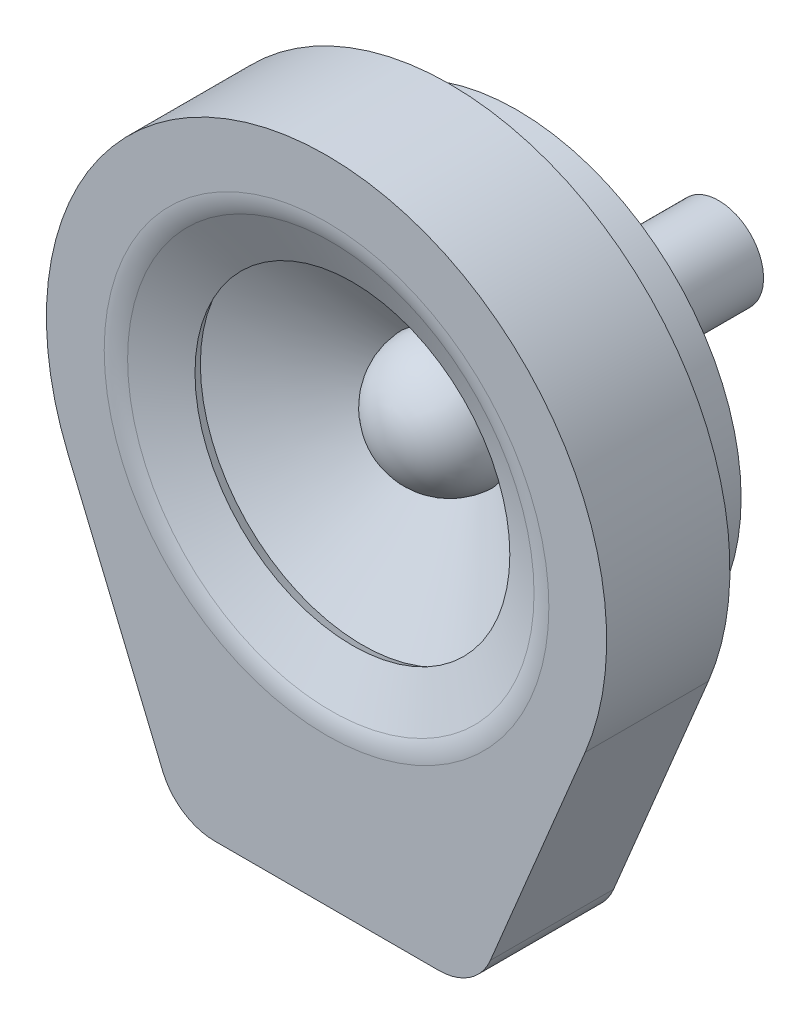
ISO-10303-21;
HEADER;
FILE_DESCRIPTION(('STEP AP214'),'2;1');
FILE_NAME('part.step','',(''),(''),'','','');
FILE_SCHEMA(('AUTOMOTIVE_DESIGN { 1 0 10303 214 1 1 1 1 }'));
ENDSEC;
DATA;
#1=APPLICATION_CONTEXT('core data for automotive mechanical design processes');
#2=APPLICATION_PROTOCOL_DEFINITION('international standard','automotive_design',2000,#1);
#3=PRODUCT_CONTEXT('',#1,'mechanical');
#4=PRODUCT('Part','Part','',(#3));
#5=PRODUCT_RELATED_PRODUCT_CATEGORY('part','',(#4));
#6=PRODUCT_DEFINITION_FORMATION('','',#4);
#7=PRODUCT_DEFINITION_CONTEXT('part definition',#1,'design');
#8=PRODUCT_DEFINITION('design','',#6,#7);
#9=PRODUCT_DEFINITION_SHAPE('','',#8);
#10=(LENGTH_UNIT() NAMED_UNIT(*) SI_UNIT(.MILLI.,.METRE.));
#11=(NAMED_UNIT(*) PLANE_ANGLE_UNIT() SI_UNIT($,.RADIAN.));
#12=(NAMED_UNIT(*) SI_UNIT($,.STERADIAN.) SOLID_ANGLE_UNIT());
#13=UNCERTAINTY_MEASURE_WITH_UNIT(LENGTH_MEASURE(1.E-05),#10,'distance_accuracy_value','');
#14=(GEOMETRIC_REPRESENTATION_CONTEXT(3) GLOBAL_UNCERTAINTY_ASSIGNED_CONTEXT((#13)) GLOBAL_UNIT_ASSIGNED_CONTEXT((#10,
#11,#12)) REPRESENTATION_CONTEXT('',''));
#15=CARTESIAN_POINT('',(0.,0.,0.));
#16=DIRECTION('',(0.,0.,1.));
#17=DIRECTION('',(1.,0.,0.));
#18=AXIS2_PLACEMENT_3D('',#15,#16,#17);
#19=CARTESIAN_POINT('',(0.,0.,0.));
#20=DIRECTION('',(0.,0.,1.));
#21=DIRECTION('',(1.,0.,0.));
#22=AXIS2_PLACEMENT_3D('',#19,#20,#21);
#23=PLANE('',#22);
#24=CARTESIAN_POINT('',(0.,0.,0.));
#25=DIRECTION('',(0.,0.,1.));
#26=DIRECTION('',(1.,0.,0.));
#27=AXIS2_PLACEMENT_3D('',#24,#25,#26);
#28=CIRCLE('',#27,12.5);
#29=CARTESIAN_POINT('',(11.5392129441462,-4.80588853695639,0.));
#30=VERTEX_POINT('',#29);
#31=CARTESIAN_POINT('',(-11.5392129441462,-4.80588853695639,0.));
#32=VERTEX_POINT('',#31);
#33=EDGE_CURVE('E145',#30,#32,#28,.T.);
#34=ORIENTED_EDGE('',*,*,#33,.F.);
#35=DIRECTION('',(0.384471082956511,0.923137035531696,0.));
#36=VECTOR('',#35,1.);
#37=CARTESIAN_POINT('',(7.30970543354696,-14.9611777073913,0.));
#38=LINE('',#37,#36);
#39=CARTESIAN_POINT('',(7.30970543354696,-14.9611777073913,0.));
#40=VERTEX_POINT('',#39);
#41=EDGE_CURVE('E69',#40,#30,#38,.T.);
#42=ORIENTED_EDGE('',*,*,#41,.F.);
#43=CARTESIAN_POINT('',(5.00186284471772,-14.,0.));
#44=DIRECTION('',(0.,0.,1.));
#45=DIRECTION('',(1.,0.,0.));
#46=AXIS2_PLACEMENT_3D('',#43,#44,#45);
#47=CIRCLE('',#46,2.5);
#48=CARTESIAN_POINT('',(5.00186284471772,-16.5,0.));
#49=VERTEX_POINT('',#48);
#50=EDGE_CURVE('E230',#49,#40,#47,.T.);
#51=ORIENTED_EDGE('',*,*,#50,.F.);
#52=DIRECTION('',(1.,0.,0.));
#53=VECTOR('',#52,1.);
#54=CARTESIAN_POINT('',(-5.00186284471772,-16.5,0.));
#55=LINE('',#54,#53);
#56=CARTESIAN_POINT('',(-5.00186284471771,-16.5,0.));
#57=VERTEX_POINT('',#56);
#58=EDGE_CURVE('E228',#57,#49,#55,.T.);
#59=ORIENTED_EDGE('',*,*,#58,.F.);
#60=CARTESIAN_POINT('',(-5.00186284471772,-14.,0.));
#61=DIRECTION('',(0.,0.,1.));
#62=DIRECTION('',(1.,0.,0.));
#63=AXIS2_PLACEMENT_3D('',#60,#61,#62);
#64=CIRCLE('',#63,2.5);
#65=CARTESIAN_POINT('',(-7.30970543354696,-14.9611777073913,0.));
#66=VERTEX_POINT('',#65);
#67=EDGE_CURVE('E226',#66,#57,#64,.T.);
#68=ORIENTED_EDGE('',*,*,#67,.F.);
#69=DIRECTION('',(0.384471082956511,-0.923137035531696,0.));
#70=VECTOR('',#69,1.);
#71=CARTESIAN_POINT('',(-7.30970543354696,-14.9611777073913,0.));
#72=LINE('',#71,#70);
#73=EDGE_CURVE('E224',#32,#66,#72,.T.);
#74=ORIENTED_EDGE('',*,*,#73,.F.);
#75=EDGE_LOOP('',(#34,#42,#51,#59,#68,#74));
#76=FACE_BOUND('',#75,.T.);
#77=CARTESIAN_POINT('',(0.,0.,0.));
#78=DIRECTION('',(0.,0.,1.));
#79=DIRECTION('',(1.,0.,0.));
#80=AXIS2_PLACEMENT_3D('',#77,#78,#79);
#81=CIRCLE('',#80,12.);
#82=CARTESIAN_POINT('',(11.0776444263804,-4.61365299547813,0.));
#83=VERTEX_POINT('',#82);
#84=CARTESIAN_POINT('',(-11.0776444263804,-4.61365299547814,0.));
#85=VERTEX_POINT('',#84);
#86=EDGE_CURVE('E61',#83,#85,#81,.T.);
#87=ORIENTED_EDGE('',*,*,#86,.T.);
#88=DIRECTION('',(0.384471082956511,-0.923137035531696,0.));
#89=VECTOR('',#88,1.);
#90=CARTESIAN_POINT('',(-6.84813691578111,-14.768942165913,0.));
#91=LINE('',#90,#89);
#92=CARTESIAN_POINT('',(-6.84813691578111,-14.768942165913,0.));
#93=VERTEX_POINT('',#92);
#94=EDGE_CURVE('E198',#85,#93,#91,.T.);
#95=ORIENTED_EDGE('',*,*,#94,.T.);
#96=CARTESIAN_POINT('',(-5.00186284471772,-14.,0.));
#97=DIRECTION('',(0.,0.,1.));
#98=DIRECTION('',(1.,0.,0.));
#99=AXIS2_PLACEMENT_3D('',#96,#97,#98);
#100=CIRCLE('',#99,2.);
#101=CARTESIAN_POINT('',(-5.00186284471772,-16.,0.));
#102=VERTEX_POINT('',#101);
#103=EDGE_CURVE('E201',#93,#102,#100,.T.);
#104=ORIENTED_EDGE('',*,*,#103,.T.);
#105=DIRECTION('',(1.,0.,0.));
#106=VECTOR('',#105,1.);
#107=CARTESIAN_POINT('',(-5.00186284471772,-16.,0.));
#108=LINE('',#107,#106);
#109=CARTESIAN_POINT('',(5.00186284471772,-16.,0.));
#110=VERTEX_POINT('',#109);
#111=EDGE_CURVE('E204',#102,#110,#108,.T.);
#112=ORIENTED_EDGE('',*,*,#111,.T.);
#113=CARTESIAN_POINT('',(5.00186284471772,-14.,0.));
#114=DIRECTION('',(0.,0.,1.));
#115=DIRECTION('',(1.,0.,0.));
#116=AXIS2_PLACEMENT_3D('',#113,#114,#115);
#117=CIRCLE('',#116,2.);
#118=CARTESIAN_POINT('',(6.84813691578111,-14.768942165913,0.));
#119=VERTEX_POINT('',#118);
#120=EDGE_CURVE('E207',#110,#119,#117,.T.);
#121=ORIENTED_EDGE('',*,*,#120,.T.);
#122=DIRECTION('',(0.384471082956511,0.923137035531696,0.));
#123=VECTOR('',#122,1.);
#124=CARTESIAN_POINT('',(6.84813691578111,-14.768942165913,0.));
#125=LINE('',#124,#123);
#126=EDGE_CURVE('E181',#119,#83,#125,.T.);
#127=ORIENTED_EDGE('',*,*,#126,.T.);
#128=EDGE_LOOP('',(#87,#95,#104,#112,#121,#127));
#129=FACE_BOUND('',#128,.T.);
#130=ADVANCED_FACE('F46',(#76,#129),#23,.F.);
#131=CARTESIAN_POINT('',(0.,0.,5.));
#132=DIRECTION('',(0.,0.,-1.));
#133=DIRECTION('',(-1.,0.,0.));
#134=AXIS2_PLACEMENT_3D('',#131,#132,#133);
#135=CYLINDRICAL_SURFACE('',#134,12.5);
#136=ORIENTED_EDGE('',*,*,#33,.T.);
#137=DIRECTION('',(0.,0.,-1.));
#138=VECTOR('',#137,1.);
#139=CARTESIAN_POINT('',(-11.5392129441462,-4.80588853695639,5.));
#140=LINE('',#139,#138);
#141=CARTESIAN_POINT('',(-11.5392129441462,-4.80588853695639,5.5));
#142=VERTEX_POINT('',#141);
#143=EDGE_CURVE('E139',#142,#32,#140,.T.);
#144=ORIENTED_EDGE('',*,*,#143,.F.);
#145=CARTESIAN_POINT('',(0.,0.,5.5));
#146=DIRECTION('',(0.,0.,1.));
#147=DIRECTION('',(1.,0.,0.));
#148=AXIS2_PLACEMENT_3D('',#145,#146,#147);
#149=CIRCLE('',#148,12.5);
#150=CARTESIAN_POINT('',(11.5392129441462,-4.80588853695639,5.5));
#151=VERTEX_POINT('',#150);
#152=EDGE_CURVE('E143',#151,#142,#149,.T.);
#153=ORIENTED_EDGE('',*,*,#152,.F.);
#154=DIRECTION('',(0.,0.,-1.));
#155=VECTOR('',#154,1.);
#156=CARTESIAN_POINT('',(11.5392129441462,-4.80588853695639,5.));
#157=LINE('',#156,#155);
#158=EDGE_CURVE('E233',#151,#30,#157,.T.);
#159=ORIENTED_EDGE('',*,*,#158,.T.);
#160=EDGE_LOOP('',(#136,#144,#153,#159));
#161=FACE_BOUND('',#160,.T.);
#162=ADVANCED_FACE('F141',(#161),#135,.T.);
#163=CARTESIAN_POINT('',(-7.30970543354696,-14.9611777073913,5.));
#164=DIRECTION('',(0.923137035531696,0.384471082956511,0.));
#165=DIRECTION('',(-0.384471082956511,0.923137035531696,0.));
#166=AXIS2_PLACEMENT_3D('',#163,#164,#165);
#167=PLANE('',#166);
#168=ORIENTED_EDGE('',*,*,#73,.T.);
#169=DIRECTION('',(0.,0.,-1.));
#170=VECTOR('',#169,1.);
#171=CARTESIAN_POINT('',(-7.30970543354696,-14.9611777073913,5.));
#172=LINE('',#171,#170);
#173=CARTESIAN_POINT('',(-7.30970543354696,-14.9611777073913,5.5));
#174=VERTEX_POINT('',#173);
#175=EDGE_CURVE('E147',#174,#66,#172,.T.);
#176=ORIENTED_EDGE('',*,*,#175,.F.);
#177=DIRECTION('',(0.384471082956511,-0.923137035531696,0.));
#178=VECTOR('',#177,1.);
#179=CARTESIAN_POINT('',(-11.5392129441462,-4.80588853695639,5.5));
#180=LINE('',#179,#178);
#181=EDGE_CURVE('E150',#142,#174,#180,.T.);
#182=ORIENTED_EDGE('',*,*,#181,.F.);
#183=ORIENTED_EDGE('',*,*,#143,.T.);
#184=EDGE_LOOP('',(#168,#176,#182,#183));
#185=FACE_BOUND('',#184,.T.);
#186=ADVANCED_FACE('F151',(#185),#167,.F.);
#187=CARTESIAN_POINT('',(-5.00186284471772,-14.,5.));
#188=DIRECTION('',(0.,0.,-1.));
#189=DIRECTION('',(-1.,0.,0.));
#190=AXIS2_PLACEMENT_3D('',#187,#188,#189);
#191=CYLINDRICAL_SURFACE('',#190,2.5);
#192=ORIENTED_EDGE('',*,*,#67,.T.);
#193=DIRECTION('',(0.,0.,-1.));
#194=VECTOR('',#193,1.);
#195=CARTESIAN_POINT('',(-5.00186284471771,-16.5,5.));
#196=LINE('',#195,#194);
#197=CARTESIAN_POINT('',(-5.00186284471772,-16.5,5.5));
#198=VERTEX_POINT('',#197);
#199=EDGE_CURVE('E240',#198,#57,#196,.T.);
#200=ORIENTED_EDGE('',*,*,#199,.F.);
#201=CARTESIAN_POINT('',(-5.00186284471772,-14.,5.5));
#202=DIRECTION('',(0.,0.,1.));
#203=DIRECTION('',(1.,0.,0.));
#204=AXIS2_PLACEMENT_3D('',#201,#202,#203);
#205=CIRCLE('',#204,2.5);
#206=EDGE_CURVE('E156',#174,#198,#205,.T.);
#207=ORIENTED_EDGE('',*,*,#206,.F.);
#208=ORIENTED_EDGE('',*,*,#175,.T.);
#209=EDGE_LOOP('',(#192,#200,#207,#208));
#210=FACE_BOUND('',#209,.T.);
#211=ADVANCED_FACE('F278',(#210),#191,.T.);
#212=CARTESIAN_POINT('',(-5.00186284471772,-16.5,5.));
#213=DIRECTION('',(0.,1.,0.));
#214=DIRECTION('',(0.,0.,1.));
#215=AXIS2_PLACEMENT_3D('',#212,#213,#214);
#216=PLANE('',#215);
#217=ORIENTED_EDGE('',*,*,#58,.T.);
#218=DIRECTION('',(0.,0.,-1.));
#219=VECTOR('',#218,1.);
#220=CARTESIAN_POINT('',(5.00186284471772,-16.5,5.));
#221=LINE('',#220,#219);
#222=CARTESIAN_POINT('',(5.00186284471772,-16.5,5.5));
#223=VERTEX_POINT('',#222);
#224=EDGE_CURVE('E237',#223,#49,#221,.T.);
#225=ORIENTED_EDGE('',*,*,#224,.F.);
#226=DIRECTION('',(1.,0.,0.));
#227=VECTOR('',#226,1.);
#228=CARTESIAN_POINT('',(-5.00186284471772,-16.5,5.5));
#229=LINE('',#228,#227);
#230=EDGE_CURVE('E171',#198,#223,#229,.T.);
#231=ORIENTED_EDGE('',*,*,#230,.F.);
#232=ORIENTED_EDGE('',*,*,#199,.T.);
#233=EDGE_LOOP('',(#217,#225,#231,#232));
#234=FACE_BOUND('',#233,.T.);
#235=ADVANCED_FACE('F274',(#234),#216,.F.);
#236=CARTESIAN_POINT('',(5.00186284471772,-14.,5.));
#237=DIRECTION('',(0.,0.,-1.));
#238=DIRECTION('',(-1.,0.,0.));
#239=AXIS2_PLACEMENT_3D('',#236,#237,#238);
#240=CYLINDRICAL_SURFACE('',#239,2.5);
#241=ORIENTED_EDGE('',*,*,#50,.T.);
#242=DIRECTION('',(0.,0.,-1.));
#243=VECTOR('',#242,1.);
#244=CARTESIAN_POINT('',(7.30970543354696,-14.9611777073913,5.));
#245=LINE('',#244,#243);
#246=CARTESIAN_POINT('',(7.30970543354696,-14.9611777073913,5.5));
#247=VERTEX_POINT('',#246);
#248=EDGE_CURVE('E235',#247,#40,#245,.T.);
#249=ORIENTED_EDGE('',*,*,#248,.F.);
#250=CARTESIAN_POINT('',(5.00186284471772,-14.,5.5));
#251=DIRECTION('',(0.,0.,1.));
#252=DIRECTION('',(1.,0.,0.));
#253=AXIS2_PLACEMENT_3D('',#250,#251,#252);
#254=CIRCLE('',#253,2.5);
#255=EDGE_CURVE('E174',#223,#247,#254,.T.);
#256=ORIENTED_EDGE('',*,*,#255,.F.);
#257=ORIENTED_EDGE('',*,*,#224,.T.);
#258=EDGE_LOOP('',(#241,#249,#256,#257));
#259=FACE_BOUND('',#258,.T.);
#260=ADVANCED_FACE('F271',(#259),#240,.T.);
#261=CARTESIAN_POINT('',(7.30970543354696,-14.9611777073913,5.));
#262=DIRECTION('',(-0.923137035531696,0.384471082956511,0.));
#263=DIRECTION('',(-0.384471082956511,-0.923137035531696,0.));
#264=AXIS2_PLACEMENT_3D('',#261,#262,#263);
#265=PLANE('',#264);
#266=ORIENTED_EDGE('',*,*,#41,.T.);
#267=ORIENTED_EDGE('',*,*,#158,.F.);
#268=DIRECTION('',(0.384471082956511,0.923137035531696,0.));
#269=VECTOR('',#268,1.);
#270=CARTESIAN_POINT('',(7.30970543354696,-14.9611777073913,5.5));
#271=LINE('',#270,#269);
#272=EDGE_CURVE('E162',#247,#151,#271,.T.);
#273=ORIENTED_EDGE('',*,*,#272,.F.);
#274=ORIENTED_EDGE('',*,*,#248,.T.);
#275=EDGE_LOOP('',(#266,#267,#273,#274));
#276=FACE_BOUND('',#275,.T.);
#277=ADVANCED_FACE('F268',(#276),#265,.F.);
#278=CARTESIAN_POINT('',(0.,0.,5.));
#279=DIRECTION('',(0.,0.,-1.));
#280=DIRECTION('',(-1.,0.,0.));
#281=AXIS2_PLACEMENT_3D('',#278,#279,#280);
#282=CYLINDRICAL_SURFACE('',#281,12.);
#283=ORIENTED_EDGE('',*,*,#86,.F.);
#284=DIRECTION('',(0.,0.,-1.));
#285=VECTOR('',#284,1.);
#286=CARTESIAN_POINT('',(11.0776444263804,-4.61365299547813,5.));
#287=LINE('',#286,#285);
#288=CARTESIAN_POINT('',(11.0776444263804,-4.61365299547813,5.));
#289=VERTEX_POINT('',#288);
#290=EDGE_CURVE('E196',#289,#83,#287,.T.);
#291=ORIENTED_EDGE('',*,*,#290,.F.);
#292=CARTESIAN_POINT('',(0.,0.,5.));
#293=DIRECTION('',(0.,0.,1.));
#294=DIRECTION('',(1.,0.,0.));
#295=AXIS2_PLACEMENT_3D('',#292,#293,#294);
#296=CIRCLE('',#295,12.);
#297=CARTESIAN_POINT('',(-11.0776444263804,-4.61365299547813,5.));
#298=VERTEX_POINT('',#297);
#299=EDGE_CURVE('E177',#289,#298,#296,.T.);
#300=ORIENTED_EDGE('',*,*,#299,.T.);
#301=DIRECTION('',(0.,0.,-1.));
#302=VECTOR('',#301,1.);
#303=CARTESIAN_POINT('',(-11.0776444263804,-4.61365299547814,5.));
#304=LINE('',#303,#302);
#305=EDGE_CURVE('E221',#298,#85,#304,.T.);
#306=ORIENTED_EDGE('',*,*,#305,.T.);
#307=EDGE_LOOP('',(#283,#291,#300,#306));
#308=FACE_BOUND('',#307,.T.);
#309=ADVANCED_FACE('F266',(#308),#282,.F.);
#310=CARTESIAN_POINT('',(-6.84813691578111,-14.768942165913,5.));
#311=DIRECTION('',(0.923137035531696,0.384471082956511,0.));
#312=DIRECTION('',(-0.384471082956511,0.923137035531696,0.));
#313=AXIS2_PLACEMENT_3D('',#310,#311,#312);
#314=PLANE('',#313);
#315=ORIENTED_EDGE('',*,*,#94,.F.);
#316=ORIENTED_EDGE('',*,*,#305,.F.);
#317=DIRECTION('',(0.384471082956511,-0.923137035531696,0.));
#318=VECTOR('',#317,1.);
#319=CARTESIAN_POINT('',(-6.84813691578111,-14.768942165913,5.));
#320=LINE('',#319,#318);
#321=CARTESIAN_POINT('',(-6.84813691578111,-14.768942165913,5.));
#322=VERTEX_POINT('',#321);
#323=EDGE_CURVE('E180',#298,#322,#320,.T.);
#324=ORIENTED_EDGE('',*,*,#323,.T.);
#325=DIRECTION('',(0.,0.,-1.));
#326=VECTOR('',#325,1.);
#327=CARTESIAN_POINT('',(-6.84813691578111,-14.768942165913,5.));
#328=LINE('',#327,#326);
#329=EDGE_CURVE('E219',#322,#93,#328,.T.);
#330=ORIENTED_EDGE('',*,*,#329,.T.);
#331=EDGE_LOOP('',(#315,#316,#324,#330));
#332=FACE_BOUND('',#331,.T.);
#333=ADVANCED_FACE('F310',(#332),#314,.T.);
#334=CARTESIAN_POINT('',(-5.00186284471772,-14.,5.));
#335=DIRECTION('',(0.,0.,-1.));
#336=DIRECTION('',(-1.,0.,0.));
#337=AXIS2_PLACEMENT_3D('',#334,#335,#336);
#338=CYLINDRICAL_SURFACE('',#337,2.);
#339=ORIENTED_EDGE('',*,*,#103,.F.);
#340=ORIENTED_EDGE('',*,*,#329,.F.);
#341=CARTESIAN_POINT('',(-5.00186284471772,-14.,5.));
#342=DIRECTION('',(0.,0.,1.));
#343=DIRECTION('',(1.,0.,0.));
#344=AXIS2_PLACEMENT_3D('',#341,#342,#343);
#345=CIRCLE('',#344,2.);
#346=CARTESIAN_POINT('',(-5.00186284471772,-16.,5.));
#347=VERTEX_POINT('',#346);
#348=EDGE_CURVE('E184',#322,#347,#345,.T.);
#349=ORIENTED_EDGE('',*,*,#348,.T.);
#350=DIRECTION('',(0.,0.,-1.));
#351=VECTOR('',#350,1.);
#352=CARTESIAN_POINT('',(-5.00186284471772,-16.,5.));
#353=LINE('',#352,#351);
#354=EDGE_CURVE('E217',#347,#102,#353,.T.);
#355=ORIENTED_EDGE('',*,*,#354,.T.);
#356=EDGE_LOOP('',(#339,#340,#349,#355));
#357=FACE_BOUND('',#356,.T.);
#358=ADVANCED_FACE('F316',(#357),#338,.F.);
#359=CARTESIAN_POINT('',(-5.00186284471772,-16.,5.));
#360=DIRECTION('',(0.,1.,0.));
#361=DIRECTION('',(0.,0.,1.));
#362=AXIS2_PLACEMENT_3D('',#359,#360,#361);
#363=PLANE('',#362);
#364=ORIENTED_EDGE('',*,*,#111,.F.);
#365=ORIENTED_EDGE('',*,*,#354,.F.);
#366=DIRECTION('',(1.,0.,0.));
#367=VECTOR('',#366,1.);
#368=CARTESIAN_POINT('',(-5.00186284471772,-16.,5.));
#369=LINE('',#368,#367);
#370=CARTESIAN_POINT('',(5.00186284471772,-16.,5.));
#371=VERTEX_POINT('',#370);
#372=EDGE_CURVE('E187',#347,#371,#369,.T.);
#373=ORIENTED_EDGE('',*,*,#372,.T.);
#374=DIRECTION('',(0.,0.,-1.));
#375=VECTOR('',#374,1.);
#376=CARTESIAN_POINT('',(5.00186284471772,-16.,5.));
#377=LINE('',#376,#375);
#378=EDGE_CURVE('E215',#371,#110,#377,.T.);
#379=ORIENTED_EDGE('',*,*,#378,.T.);
#380=EDGE_LOOP('',(#364,#365,#373,#379));
#381=FACE_BOUND('',#380,.T.);
#382=ADVANCED_FACE('F323',(#381),#363,.T.);
#383=CARTESIAN_POINT('',(5.00186284471772,-14.,5.));
#384=DIRECTION('',(0.,0.,-1.));
#385=DIRECTION('',(-1.,0.,0.));
#386=AXIS2_PLACEMENT_3D('',#383,#384,#385);
#387=CYLINDRICAL_SURFACE('',#386,2.);
#388=ORIENTED_EDGE('',*,*,#120,.F.);
#389=ORIENTED_EDGE('',*,*,#378,.F.);
#390=CARTESIAN_POINT('',(5.00186284471772,-14.,5.));
#391=DIRECTION('',(0.,0.,1.));
#392=DIRECTION('',(1.,0.,0.));
#393=AXIS2_PLACEMENT_3D('',#390,#391,#392);
#394=CIRCLE('',#393,2.);
#395=CARTESIAN_POINT('',(6.84813691578111,-14.768942165913,5.));
#396=VERTEX_POINT('',#395);
#397=EDGE_CURVE('E190',#371,#396,#394,.T.);
#398=ORIENTED_EDGE('',*,*,#397,.T.);
#399=DIRECTION('',(0.,0.,-1.));
#400=VECTOR('',#399,1.);
#401=CARTESIAN_POINT('',(6.84813691578111,-14.768942165913,5.));
#402=LINE('',#401,#400);
#403=EDGE_CURVE('E213',#396,#119,#402,.T.);
#404=ORIENTED_EDGE('',*,*,#403,.T.);
#405=EDGE_LOOP('',(#388,#389,#398,#404));
#406=FACE_BOUND('',#405,.T.);
#407=ADVANCED_FACE('F331',(#406),#387,.F.);
#408=CARTESIAN_POINT('',(6.84813691578111,-14.768942165913,5.));
#409=DIRECTION('',(-0.923137035531696,0.384471082956511,0.));
#410=DIRECTION('',(-0.384471082956511,-0.923137035531696,0.));
#411=AXIS2_PLACEMENT_3D('',#408,#409,#410);
#412=PLANE('',#411);
#413=ORIENTED_EDGE('',*,*,#126,.F.);
#414=ORIENTED_EDGE('',*,*,#403,.F.);
#415=DIRECTION('',(0.384471082956511,0.923137035531696,0.));
#416=VECTOR('',#415,1.);
#417=CARTESIAN_POINT('',(6.84813691578111,-14.768942165913,5.));
#418=LINE('',#417,#416);
#419=EDGE_CURVE('E193',#396,#289,#418,.T.);
#420=ORIENTED_EDGE('',*,*,#419,.T.);
#421=ORIENTED_EDGE('',*,*,#290,.T.);
#422=EDGE_LOOP('',(#413,#414,#420,#421));
#423=FACE_BOUND('',#422,.T.);
#424=ADVANCED_FACE('F339',(#423),#412,.T.);
#425=CARTESIAN_POINT('',(0.,0.,5.5));
#426=DIRECTION('',(0.,0.,1.));
#427=DIRECTION('',(1.,0.,0.));
#428=AXIS2_PLACEMENT_3D('',#425,#426,#427);
#429=PLANE('',#428);
#430=CARTESIAN_POINT('',(0.,0.,5.5));
#431=DIRECTION('',(0.,0.,1.));
#432=DIRECTION('',(1.,0.,0.));
#433=AXIS2_PLACEMENT_3D('',#430,#431,#432);
#434=CIRCLE('',#433,9.92109103035221);
#435=CARTESIAN_POINT('',(9.92109103035221,0.,5.5));
#436=VERTEX_POINT('',#435);
#437=EDGE_CURVE('E54',#436,#436,#434,.F.);
#438=ORIENTED_EDGE('',*,*,#437,.T.);
#439=EDGE_LOOP('',(#438));
#440=FACE_BOUND('',#439,.T.);
#441=ORIENTED_EDGE('',*,*,#152,.T.);
#442=ORIENTED_EDGE('',*,*,#181,.T.);
#443=ORIENTED_EDGE('',*,*,#206,.T.);
#444=ORIENTED_EDGE('',*,*,#230,.T.);
#445=ORIENTED_EDGE('',*,*,#255,.T.);
#446=ORIENTED_EDGE('',*,*,#272,.T.);
#447=EDGE_LOOP('',(#441,#442,#443,#444,#445,#446));
#448=FACE_BOUND('',#447,.T.);
#449=ADVANCED_FACE('F159',(#440,#448),#429,.T.);
#450=CARTESIAN_POINT('',(0.,0.,5.));
#451=DIRECTION('',(0.,0.,1.));
#452=DIRECTION('',(1.,0.,0.));
#453=AXIS2_PLACEMENT_3D('',#450,#451,#452);
#454=PLANE('',#453);
#455=ORIENTED_EDGE('',*,*,#299,.F.);
#456=ORIENTED_EDGE('',*,*,#419,.F.);
#457=ORIENTED_EDGE('',*,*,#397,.F.);
#458=ORIENTED_EDGE('',*,*,#372,.F.);
#459=ORIENTED_EDGE('',*,*,#348,.F.);
#460=ORIENTED_EDGE('',*,*,#323,.F.);
#461=EDGE_LOOP('',(#455,#456,#457,#458,#459,#460));
#462=FACE_BOUND('',#461,.T.);
#463=CARTESIAN_POINT('',(0.,0.,5.));
#464=DIRECTION('',(0.,0.,-1.));
#465=DIRECTION('',(-1.,0.,0.));
#466=AXIS2_PLACEMENT_3D('',#463,#464,#465);
#467=CIRCLE('',#466,9.58517656815572);
#468=CARTESIAN_POINT('',(-9.58517656815572,0.,5.));
#469=VERTEX_POINT('',#468);
#470=EDGE_CURVE('E163',#469,#469,#467,.T.);
#471=ORIENTED_EDGE('',*,*,#470,.F.);
#472=EDGE_LOOP('',(#471));
#473=FACE_BOUND('',#472,.T.);
#474=ADVANCED_FACE('F355',(#462,#473),#454,.F.);
#475=CARTESIAN_POINT('',(0.,0.,5.5));
#476=DIRECTION('',(0.,0.,1.));
#477=DIRECTION('',(1.,0.,0.));
#478=AXIS2_PLACEMENT_3D('',#475,#476,#477);
#479=CONICAL_SURFACE('',#478,9.47320508075689,1.13018008063184);
#480=CARTESIAN_POINT('',(0.,0.,5.30897801576319));
#481=DIRECTION('',(0.,0.,-1.));
#482=DIRECTION('',(-1.,0.,0.));
#483=AXIS2_PLACEMENT_3D('',#480,#481,#482);
#484=CIRCLE('',#483,9.06809716256332);
#485=CARTESIAN_POINT('',(-9.06809716256332,0.,5.30897801576319));
#486=VERTEX_POINT('',#485);
#487=EDGE_CURVE('E12',#486,#486,#484,.F.);
#488=ORIENTED_EDGE('',*,*,#487,.T.);
#489=EDGE_LOOP('',(#488));
#490=FACE_BOUND('',#489,.T.);
#491=CARTESIAN_POINT('',(0.,0.,4.34544749938727));
#492=DIRECTION('',(0.,0.,-1.));
#493=DIRECTION('',(-1.,0.,0.));
#494=AXIS2_PLACEMENT_3D('',#491,#492,#493);
#495=CIRCLE('',#494,7.02469968051675);
#496=CARTESIAN_POINT('',(-7.02469968051675,0.,4.34544749938727));
#497=VERTEX_POINT('',#496);
#498=EDGE_CURVE('E501',#497,#497,#495,.T.);
#499=ORIENTED_EDGE('',*,*,#498,.T.);
#500=EDGE_LOOP('',(#499));
#501=FACE_BOUND('',#500,.T.);
#502=ADVANCED_FACE('F363',(#490,#501),#479,.F.);
#503=CARTESIAN_POINT('',(0.,0.,5.));
#504=DIRECTION('',(0.,0.,1.));
#505=DIRECTION('',(1.,0.,0.));
#506=AXIS2_PLACEMENT_3D('',#503,#504,#505);
#507=CONICAL_SURFACE('',#506,9.58517656815572,1.13018008063184);
#508=CARTESIAN_POINT('',(0.,0.,3.89320299544648));
#509=DIRECTION('',(0.,0.,-1.));
#510=DIRECTION('',(-1.,0.,0.));
#511=AXIS2_PLACEMENT_3D('',#508,#509,#510);
#512=CIRCLE('',#511,7.23794814746397);
#513=CARTESIAN_POINT('',(-7.23794814746397,0.,3.89320299544648));
#514=VERTEX_POINT('',#513);
#515=EDGE_CURVE('E166',#514,#514,#512,.T.);
#516=ORIENTED_EDGE('',*,*,#515,.F.);
#517=EDGE_LOOP('',(#516));
#518=FACE_BOUND('',#517,.T.);
#519=ORIENTED_EDGE('',*,*,#470,.T.);
#520=EDGE_LOOP('',(#519));
#521=FACE_BOUND('',#520,.T.);
#522=ADVANCED_FACE('F253',(#518,#521),#507,.T.);
#523=CARTESIAN_POINT('',(0.,0.,3.89320299544648));
#524=DIRECTION('',(0.,0.,-1.));
#525=DIRECTION('',(-1.,0.,0.));
#526=AXIS2_PLACEMENT_3D('',#523,#524,#525);
#527=CONICAL_SURFACE('',#526,7.23794814746397,0.440616246163057);
#528=ORIENTED_EDGE('',*,*,#498,.F.);
#529=EDGE_LOOP('',(#528));
#530=FACE_BOUND('',#529,.T.);
#531=ORIENTED_EDGE('',*,*,#515,.T.);
#532=EDGE_LOOP('',(#531));
#533=FACE_BOUND('',#532,.T.);
#534=ADVANCED_FACE('F248',(#530,#533),#527,.F.);
#535=CARTESIAN_POINT('',(0.,0.,3.5));
#536=DIRECTION('',(0.,0.,1.));
#537=DIRECTION('',(1.,0.,0.));
#538=AXIS2_PLACEMENT_3D('',#535,#536,#537);
#539=TOROIDAL_SURFACE('',#538,9.92109103035221,2.);
#540=ORIENTED_EDGE('',*,*,#487,.F.);
#541=EDGE_LOOP('',(#540));
#542=FACE_BOUND('',#541,.T.);
#543=ORIENTED_EDGE('',*,*,#437,.F.);
#544=EDGE_LOOP('',(#543));
#545=FACE_BOUND('',#544,.T.);
#546=ADVANCED_FACE('F48',(#542,#545),#539,.T.);
#547=CLOSED_SHELL('',(#130,#162,#186,#211,#235,#260,#277,#309,#333,#358,#382,#407,#424,#449,
#474,#502,#522,#534,#546));
#548=MANIFOLD_SOLID_BREP('B2',#547);
#549=CARTESIAN_POINT('',(0.,9.,3.59171250028112));
#550=DIRECTION('',(0.,0.,-1.));
#551=DIRECTION('',(-1.,0.,0.));
#552=AXIS2_PLACEMENT_3D('',#549,#550,#551);
#553=PLANE('',#552);
#554=CARTESIAN_POINT('',(0.,0.,3.59171250028112));
#555=DIRECTION('',(0.,0.,-1.));
#556=DIRECTION('',(-1.,0.,0.));
#557=AXIS2_PLACEMENT_3D('',#554,#555,#556);
#558=CIRCLE('',#557,11.);
#559=CARTESIAN_POINT('',(-11.,0.,3.59171250028112));
#560=VERTEX_POINT('',#559);
#561=EDGE_CURVE('E45',#560,#560,#558,.T.);
#562=ORIENTED_EDGE('',*,*,#561,.T.);
#563=EDGE_LOOP('',(#562));
#564=FACE_BOUND('',#563,.T.);
#565=CARTESIAN_POINT('',(0.,0.,3.59171250028112));
#566=DIRECTION('',(0.,0.,-1.));
#567=DIRECTION('',(-1.,0.,0.));
#568=AXIS2_PLACEMENT_3D('',#565,#566,#567);
#569=CIRCLE('',#568,9.);
#570=CARTESIAN_POINT('',(9.00000000000001,0.,3.59171250028112));
#571=VERTEX_POINT('',#570);
#572=EDGE_CURVE('E552',#571,#571,#569,.T.);
#573=ORIENTED_EDGE('',*,*,#572,.F.);
#574=EDGE_LOOP('',(#573));
#575=FACE_BOUND('',#574,.T.);
#576=ADVANCED_FACE('F530',(#564,#575),#553,.T.);
#577=CARTESIAN_POINT('',(0.,0.,0.));
#578=DIRECTION('',(0.,0.,-1.));
#579=DIRECTION('',(-1.,0.,0.));
#580=AXIS2_PLACEMENT_3D('',#577,#578,#579);
#581=CYLINDRICAL_SURFACE('',#580,11.);
#582=ORIENTED_EDGE('',*,*,#561,.F.);
#583=EDGE_LOOP('',(#582));
#584=FACE_BOUND('',#583,.T.);
#585=CARTESIAN_POINT('',(0.,0.,3.69171250028112));
#586=DIRECTION('',(0.,0.,-1.));
#587=DIRECTION('',(-1.,0.,0.));
#588=AXIS2_PLACEMENT_3D('',#585,#586,#587);
#589=CIRCLE('',#588,11.);
#590=CARTESIAN_POINT('',(-11.,0.,3.69171250028112));
#591=VERTEX_POINT('',#590);
#592=EDGE_CURVE('E536',#591,#591,#589,.T.);
#593=ORIENTED_EDGE('',*,*,#592,.T.);
#594=EDGE_LOOP('',(#593));
#595=FACE_BOUND('',#594,.T.);
#596=ADVANCED_FACE('F560',(#584,#595),#581,.T.);
#597=CARTESIAN_POINT('',(0.,9.,3.69171250028112));
#598=DIRECTION('',(0.,0.,-1.));
#599=DIRECTION('',(-1.,0.,0.));
#600=AXIS2_PLACEMENT_3D('',#597,#598,#599);
#601=PLANE('',#600);
#602=ORIENTED_EDGE('',*,*,#592,.F.);
#603=EDGE_LOOP('',(#602));
#604=FACE_BOUND('',#603,.T.);
#605=CARTESIAN_POINT('',(0.,0.,3.69171250028112));
#606=DIRECTION('',(0.,0.,-1.));
#607=DIRECTION('',(-1.,0.,0.));
#608=AXIS2_PLACEMENT_3D('',#605,#606,#607);
#609=CIRCLE('',#608,8.97320508075689);
#610=CARTESIAN_POINT('',(8.97320508075689,0.,3.69171250028112));
#611=VERTEX_POINT('',#610);
#612=EDGE_CURVE('E540',#611,#611,#609,.T.);
#613=ORIENTED_EDGE('',*,*,#612,.T.);
#614=EDGE_LOOP('',(#613));
#615=FACE_BOUND('',#614,.T.);
#616=ADVANCED_FACE('F564',(#604,#615),#601,.F.);
#617=CARTESIAN_POINT('',(0.,0.,0.170294668544282));
#618=DIRECTION('',(0.,0.,1.));
#619=DIRECTION('',(1.,0.,0.));
#620=AXIS2_PLACEMENT_3D('',#617,#618,#619);
#621=CONICAL_SURFACE('',#620,2.87393048150957,1.0471975511966);
#622=CARTESIAN_POINT('',(0.,0.,0.170294668544282));
#623=DIRECTION('',(0.,0.,-1.));
#624=DIRECTION('',(-1.,0.,0.));
#625=AXIS2_PLACEMENT_3D('',#622,#623,#624);
#626=CIRCLE('',#625,2.87393048150957);
#627=CARTESIAN_POINT('',(2.87393048150957,0.,0.170294668544282));
#628=VERTEX_POINT('',#627);
#629=EDGE_CURVE('E544',#628,#628,#626,.T.);
#630=CARTESIAN_POINT('',(8.97320508075689,0.,3.69171250028112));
#631=CARTESIAN_POINT('',(8.90967097034806,0.,3.65503106453386));
#632=CARTESIAN_POINT('',(8.84613685993924,0.,3.6183496287866));
#633=CARTESIAN_POINT('',(8.71906863912158,0.,3.54498675729208));
#634=CARTESIAN_POINT('',(8.65553452871275,0.,3.50830532154483));
#635=CARTESIAN_POINT('',(8.5284663078951,0.,3.43494245005031));
#636=CARTESIAN_POINT('',(8.46493219748628,0.,3.39826101430305));
#637=CARTESIAN_POINT('',(8.33786397666863,0.,3.32489814280853));
#638=CARTESIAN_POINT('',(8.2743298662598,0.,3.28821670706127));
#639=CARTESIAN_POINT('',(8.14726164544214,0.,3.21485383556676));
#640=CARTESIAN_POINT('',(8.08372753503332,0.,3.1781723998195));
#641=CARTESIAN_POINT('',(7.95665931421567,0.,3.10480952832498));
#642=CARTESIAN_POINT('',(7.89312520380684,0.,3.06812809257772));
#643=CARTESIAN_POINT('',(7.76605698298919,0.,2.9947652210832));
#644=CARTESIAN_POINT('',(7.70252287258036,0.,2.95808378533594));
#645=CARTESIAN_POINT('',(7.57545465176271,0.,2.88472091384143));
#646=CARTESIAN_POINT('',(7.51192054135388,0.,2.84803947809417));
#647=CARTESIAN_POINT('',(7.38485232053623,0.,2.77467660659965));
#648=CARTESIAN_POINT('',(7.32131821012741,0.,2.73799517085239));
#649=CARTESIAN_POINT('',(7.19424998930975,0.,2.66463229935787));
#650=CARTESIAN_POINT('',(7.13071587890093,0.,2.62795086361062));
#651=CARTESIAN_POINT('',(7.00364765808328,0.,2.5545879921161));
#652=CARTESIAN_POINT('',(6.94011354767445,0.,2.51790655636884));
#653=CARTESIAN_POINT('',(6.8130453268568,0.,2.44454368487432));
#654=CARTESIAN_POINT('',(6.74951121644797,0.,2.40786224912706));
#655=CARTESIAN_POINT('',(6.62244299563032,0.,2.33449937763255));
#656=CARTESIAN_POINT('',(6.55890888522149,0.,2.29781794188529));
#657=CARTESIAN_POINT('',(6.43184066440384,0.,2.22445507039077));
#658=CARTESIAN_POINT('',(6.36830655399501,0.,2.18777363464351));
#659=CARTESIAN_POINT('',(6.24123833317736,0.,2.11441076314899));
#660=CARTESIAN_POINT('',(6.17770422276854,0.,2.07772932740174));
#661=CARTESIAN_POINT('',(6.05063600195088,0.,2.00436645590722));
#662=CARTESIAN_POINT('',(5.98710189154206,0.,1.96768502015996));
#663=CARTESIAN_POINT('',(5.8600336707244,0.,1.89432214866544));
#664=CARTESIAN_POINT('',(5.79649956031558,0.,1.85764071291818));
#665=CARTESIAN_POINT('',(5.66943133949793,0.,1.78427784142367));
#666=CARTESIAN_POINT('',(5.6058972290891,0.,1.74759640567641));
#667=CARTESIAN_POINT('',(5.47882900827145,0.,1.67423353418189));
#668=CARTESIAN_POINT('',(5.41529489786262,0.,1.63755209843463));
#669=CARTESIAN_POINT('',(5.28822667704497,0.,1.56418922694011));
#670=CARTESIAN_POINT('',(5.22469256663614,0.,1.52750779119285));
#671=CARTESIAN_POINT('',(5.09762434581849,0.,1.45414491969834));
#672=CARTESIAN_POINT('',(5.03409023540966,0.,1.41746348395108));
#673=CARTESIAN_POINT('',(4.90702201459201,0.,1.34410061245656));
#674=CARTESIAN_POINT('',(4.84348790418319,0.,1.3074191767093));
#675=CARTESIAN_POINT('',(4.71641968336553,0.,1.23405630521478));
#676=CARTESIAN_POINT('',(4.65288557295671,0.,1.19737486946753));
#677=CARTESIAN_POINT('',(4.52581735213906,0.,1.12401199797301));
#678=CARTESIAN_POINT('',(4.46228324173023,0.,1.08733056222575));
#679=CARTESIAN_POINT('',(4.33521502091258,0.,1.01396769073123));
#680=CARTESIAN_POINT('',(4.27168091050375,0.,0.977286254983974));
#681=CARTESIAN_POINT('',(4.1446126896861,0.,0.903923383489456));
#682=CARTESIAN_POINT('',(4.08107857927727,0.,0.867241947742198));
#683=CARTESIAN_POINT('',(3.95401035845962,0.,0.79387907624768));
#684=CARTESIAN_POINT('',(3.89047624805079,0.,0.757197640500422));
#685=CARTESIAN_POINT('',(3.76340802723314,0.,0.683834769005904));
#686=CARTESIAN_POINT('',(3.69987391682432,0.,0.647153333258646));
#687=CARTESIAN_POINT('',(3.57280569600666,0.,0.573790461764128));
#688=CARTESIAN_POINT('',(3.50927158559784,0.,0.537109026016869));
#689=CARTESIAN_POINT('',(3.38220336478018,0.,0.463746154522352));
#690=CARTESIAN_POINT('',(3.31866925437136,0.,0.427064718775093));
#691=CARTESIAN_POINT('',(3.19160103355371,0.,0.353701847280576));
#692=CARTESIAN_POINT('',(3.12806692314488,0.,0.317020411533317));
#693=CARTESIAN_POINT('',(3.00099870232723,0.,0.243657540038799));
#694=CARTESIAN_POINT('',(2.9374645919184,0.,0.206976104291541));
#695=CARTESIAN_POINT('',(2.87393048150957,0.,0.170294668544282));
#696=B_SPLINE_CURVE_WITH_KNOTS('',3,(#630,#631,#632,#633,#634,#635,#636,#637,#638,#639,#640,
#641,#642,#643,#644,#645,#646,#647,#648,#649,#650,#651,#652,#653,#654,#655,#656,#657,#658,#659,
#660,#661,#662,#663,#664,#665,#666,#667,#668,#669,#670,#671,#672,#673,#674,#675,#676,#677,#678,
#679,#680,#681,#682,#683,#684,#685,#686,#687,#688,#689,#690,#691,#692,#693,#694,#695),
.UNSPECIFIED.,.F.,.F.,(4,2,2,2,2,2,2,2,2,2,2,2,2,2,2,2,2,2,2,2,2,2,2,2,2,2,2,2,2,2,2,2,4),(0.,
0.220088614483554,0.44017722896711,0.660265843450663,0.880354457934219,1.10044307241777,
1.32053168690133,1.54062030138488,1.76070891586844,1.98079753035199,2.20088614483554,
2.4209747593191,2.64106337380265,2.86115198828621,3.08124060276976,3.30132921725332,
3.52141783173687,3.74150644622042,3.96159506070398,4.18168367518753,4.40177228967109,
4.62186090415464,4.8419495186382,5.06203813312175,5.28212674760531,5.50221536208886,
5.72230397657242,5.94239259105597,6.16248120553952,6.38256982002308,6.60265843450664,
6.82274704899019,7.04283566347374),.UNSPECIFIED.);
#697=EDGE_CURVE('BSEAM569',#611,#628,#696,.T.);
#698=ORIENTED_EDGE('',*,*,#612,.F.);
#699=ORIENTED_EDGE('',*,*,#629,.T.);
#700=ORIENTED_EDGE('',*,*,#697,.T.);
#701=ORIENTED_EDGE('',*,*,#697,.F.);
#702=EDGE_LOOP('',(#698,#700,#699,#701));
#703=FACE_BOUND('',#702,.T.);
#704=ADVANCED_FACE('F569',(#703),#621,.F.);
#705=CARTESIAN_POINT('',(0.,0.,0.));
#706=DIRECTION('',(0.,0.,-1.));
#707=DIRECTION('',(0.,1.,0.));
#708=AXIS2_PLACEMENT_3D('',#705,#706,#707);
#709=SPHERICAL_SURFACE('',#708,2.87897146333278);
#710=ORIENTED_EDGE('',*,*,#629,.F.);
#711=EDGE_LOOP('',(#710));
#712=FACE_BOUND('',#711,.T.);
#713=ADVANCED_FACE('F575',(#712),#709,.T.);
#714=CARTESIAN_POINT('',(0.,0.,0.));
#715=DIRECTION('',(0.,0.,-1.));
#716=DIRECTION('',(0.,1.,0.));
#717=AXIS2_PLACEMENT_3D('',#714,#715,#716);
#718=SPHERICAL_SURFACE('',#717,2.77897146333278);
#719=CARTESIAN_POINT('',(0.,0.,0.));
#720=DIRECTION('',(0.,0.,-1.));
#721=DIRECTION('',(-1.,0.,0.));
#722=AXIS2_PLACEMENT_3D('',#719,#720,#721);
#723=CIRCLE('',#722,2.77897146333278);
#724=CARTESIAN_POINT('',(2.77897146333278,0.,0.));
#725=VERTEX_POINT('',#724);
#726=EDGE_CURVE('E549',#725,#725,#723,.T.);
#727=ORIENTED_EDGE('',*,*,#726,.T.);
#728=EDGE_LOOP('',(#727));
#729=FACE_BOUND('',#728,.T.);
#730=ADVANCED_FACE('F579',(#729),#718,.F.);
#731=CARTESIAN_POINT('',(0.,0.,0.));
#732=DIRECTION('',(0.,0.,1.));
#733=DIRECTION('',(1.,0.,0.));
#734=AXIS2_PLACEMENT_3D('',#731,#732,#733);
#735=CONICAL_SURFACE('',#734,2.77897146333278,1.0471975511966);
#736=CARTESIAN_POINT('',(9.00000000000001,0.,3.59171250028112));
#737=CARTESIAN_POINT('',(8.93519761940972,0.,3.55429882840319));
#738=CARTESIAN_POINT('',(8.87039523881944,0.,3.51688515652526));
#739=CARTESIAN_POINT('',(8.74079047763887,0.,3.44205781276941));
#740=CARTESIAN_POINT('',(8.67598809704858,0.,3.40464414089148));
#741=CARTESIAN_POINT('',(8.54638333586802,0.,3.32981679713562));
#742=CARTESIAN_POINT('',(8.48158095527774,0.,3.29240312525769));
#743=CARTESIAN_POINT('',(8.35197619409717,0.,3.21757578150184));
#744=CARTESIAN_POINT('',(8.28717381350688,0.,3.18016210962391));
#745=CARTESIAN_POINT('',(8.15756905232632,0.,3.10533476586805));
#746=CARTESIAN_POINT('',(8.09276667173603,0.,3.06792109399012));
#747=CARTESIAN_POINT('',(7.96316191055547,0.,2.99309375023427));
#748=CARTESIAN_POINT('',(7.89835952996518,0.,2.95568007835634));
#749=CARTESIAN_POINT('',(7.76875476878462,0.,2.88085273460048));
#750=CARTESIAN_POINT('',(7.70395238819433,0.,2.84343906272255));
#751=CARTESIAN_POINT('',(7.57434762701376,0.,2.7686117189667));
#752=CARTESIAN_POINT('',(7.50954524642348,0.,2.73119804708877));
#753=CARTESIAN_POINT('',(7.37994048524291,0.,2.65637070333291));
#754=CARTESIAN_POINT('',(7.31513810465263,0.,2.61895703145498));
#755=CARTESIAN_POINT('',(7.18553334347206,0.,2.54412968769913));
#756=CARTESIAN_POINT('',(7.12073096288178,0.,2.5067160158212));
#757=CARTESIAN_POINT('',(6.99112620170121,0.,2.43188867206534));
#758=CARTESIAN_POINT('',(6.92632382111093,0.,2.39447500018741));
#759=CARTESIAN_POINT('',(6.79671905993036,0.,2.31964765643156));
#760=CARTESIAN_POINT('',(6.73191667934008,0.,2.28223398455363));
#761=CARTESIAN_POINT('',(6.60231191815951,0.,2.20740664079777));
#762=CARTESIAN_POINT('',(6.53750953756923,0.,2.16999296891984));
#763=CARTESIAN_POINT('',(6.40790477638866,0.,2.09516562516399));
#764=CARTESIAN_POINT('',(6.34310239579838,0.,2.05775195328606));
#765=CARTESIAN_POINT('',(6.21349763461781,0.,1.9829246095302));
#766=CARTESIAN_POINT('',(6.14869525402752,0.,1.94551093765227));
#767=CARTESIAN_POINT('',(6.01909049284696,0.,1.87068359389642));
#768=CARTESIAN_POINT('',(5.95428811225667,0.,1.83326992201849));
#769=CARTESIAN_POINT('',(5.82468335107611,0.,1.75844257826263));
#770=CARTESIAN_POINT('',(5.75988097048582,0.,1.7210289063847));
#771=CARTESIAN_POINT('',(5.63027620930526,0.,1.64620156262885));
#772=CARTESIAN_POINT('',(5.56547382871497,0.,1.60878789075092));
#773=CARTESIAN_POINT('',(5.43586906753441,0.,1.53396054699506));
#774=CARTESIAN_POINT('',(5.37106668694412,0.,1.49654687511713));
#775=CARTESIAN_POINT('',(5.24146192576355,0.,1.42171953136128));
#776=CARTESIAN_POINT('',(5.17665954517327,0.,1.38430585948335));
#777=CARTESIAN_POINT('',(5.0470547839927,0.,1.30947851572749));
#778=CARTESIAN_POINT('',(4.98225240340242,0.,1.27206484384956));
#779=CARTESIAN_POINT('',(4.85264764222185,0.,1.19723750009371));
#780=CARTESIAN_POINT('',(4.78784526163157,0.,1.15982382821578));
#781=CARTESIAN_POINT('',(4.658240500451,0.,1.08499648445992));
#782=CARTESIAN_POINT('',(4.59343811986072,0.,1.04758281258199));
#783=CARTESIAN_POINT('',(4.46383335868015,0.,0.972755468826137));
#784=CARTESIAN_POINT('',(4.39903097808987,0.,0.935341796948209));
#785=CARTESIAN_POINT('',(4.2694262169093,0.,0.860514453192352));
#786=CARTESIAN_POINT('',(4.20462383631902,0.,0.823100781314424));
#787=CARTESIAN_POINT('',(4.07501907513845,0.,0.748273437558567));
#788=CARTESIAN_POINT('',(4.01021669454817,0.,0.710859765680639));
#789=CARTESIAN_POINT('',(3.8806119333676,0.,0.636032421924782));
#790=CARTESIAN_POINT('',(3.81580955277731,0.,0.598618750046854));
#791=CARTESIAN_POINT('',(3.68620479159675,0.,0.523791406290997));
#792=CARTESIAN_POINT('',(3.62140241100646,0.,0.486377734413069));
#793=CARTESIAN_POINT('',(3.4917976498259,0.,0.411550390657212));
#794=CARTESIAN_POINT('',(3.42699526923561,0.,0.374136718779284));
#795=CARTESIAN_POINT('',(3.29739050805505,0.,0.299309375023427));
#796=CARTESIAN_POINT('',(3.23258812746476,0.,0.261895703145499));
#797=CARTESIAN_POINT('',(3.10298336628419,0.,0.187068359389642));
#798=CARTESIAN_POINT('',(3.03818098569391,0.,0.149654687511714));
#799=CARTESIAN_POINT('',(2.90857622451334,0.,0.0748273437558575));
#800=CARTESIAN_POINT('',(2.84377384392306,0.,0.0374136718779291));
#801=CARTESIAN_POINT('',(2.77897146333278,0.,0.));
#802=B_SPLINE_CURVE_WITH_KNOTS('',3,(#736,#737,#738,#739,#740,#741,#742,#743,#744,#745,#746,
#747,#748,#749,#750,#751,#752,#753,#754,#755,#756,#757,#758,#759,#760,#761,#762,#763,#764,#765,
#766,#767,#768,#769,#770,#771,#772,#773,#774,#775,#776,#777,#778,#779,#780,#781,#782,#783,#784,
#785,#786,#787,#788,#789,#790,#791,#792,#793,#794,#795,#796,#797,#798,#799,#800,#801),
.UNSPECIFIED.,.F.,.F.,(4,2,2,2,2,2,2,2,2,2,2,2,2,2,2,2,2,2,2,2,2,2,2,2,2,2,2,2,2,2,2,2,4),(0.,
0.224482031267574,0.448964062535144,0.673446093802718,0.897928125070289,1.12241015633786,
1.34689218760543,1.57137421887301,1.79585625014058,2.02033828140815,2.24482031267572,
2.4693023439433,2.69378437521087,2.91826640647844,3.14274843774601,3.36723046901358,
3.59171250028115,3.81619453154873,4.0406765628163,4.26515859408387,4.48964062535144,
4.71412265661902,4.93860468788659,5.16308671915416,5.38756875042173,5.61205078168931,
5.83653281295688,6.06101484422445,6.28549687549202,6.5099789067596,6.73446093802717,
6.95894296929474,7.18342500056231),.UNSPECIFIED.);
#803=EDGE_CURVE('BSEAM556',#571,#725,#802,.T.);
#804=ORIENTED_EDGE('',*,*,#572,.T.);
#805=ORIENTED_EDGE('',*,*,#726,.F.);
#806=ORIENTED_EDGE('',*,*,#803,.T.);
#807=ORIENTED_EDGE('',*,*,#803,.F.);
#808=EDGE_LOOP('',(#804,#806,#805,#807));
#809=FACE_BOUND('',#808,.T.);
#810=ADVANCED_FACE('F556',(#809),#735,.T.);
#811=CLOSED_SHELL('',(#576,#596,#616,#704,#713,#730,#810));
#812=MANIFOLD_SOLID_BREP('B6',#811);
#813=CARTESIAN_POINT('',(0.,10.,0.));
#814=DIRECTION('',(0.,0.,1.));
#815=DIRECTION('',(1.,0.,0.));
#816=AXIS2_PLACEMENT_3D('',#813,#814,#815);
#817=PLANE('',#816);
#818=CARTESIAN_POINT('',(0.,0.,0.));
#819=DIRECTION('',(0.,0.,-1.));
#820=DIRECTION('',(-1.,0.,0.));
#821=AXIS2_PLACEMENT_3D('',#818,#819,#820);
#822=CIRCLE('',#821,10.);
#823=CARTESIAN_POINT('',(-10.,0.,0.));
#824=VERTEX_POINT('',#823);
#825=EDGE_CURVE('E529',#824,#824,#822,.T.);
#826=ORIENTED_EDGE('',*,*,#825,.F.);
#827=EDGE_LOOP('',(#826));
#828=FACE_BOUND('',#827,.T.);
#829=ADVANCED_FACE('F645',(#828),#817,.T.);
#830=CARTESIAN_POINT('',(0.,0.,0.));
#831=DIRECTION('',(0.,0.,-1.));
#832=DIRECTION('',(-1.,0.,0.));
#833=AXIS2_PLACEMENT_3D('',#830,#831,#832);
#834=CYLINDRICAL_SURFACE('',#833,10.);
#835=ORIENTED_EDGE('',*,*,#825,.T.);
#836=EDGE_LOOP('',(#835));
#837=FACE_BOUND('',#836,.T.);
#838=CARTESIAN_POINT('',(0.,0.,-3.));
#839=DIRECTION('',(0.,0.,-1.));
#840=DIRECTION('',(-1.,0.,0.));
#841=AXIS2_PLACEMENT_3D('',#838,#839,#840);
#842=CIRCLE('',#841,10.);
#843=CARTESIAN_POINT('',(-10.,0.,-3.));
#844=VERTEX_POINT('',#843);
#845=EDGE_CURVE('E651',#844,#844,#842,.T.);
#846=ORIENTED_EDGE('',*,*,#845,.F.);
#847=EDGE_LOOP('',(#846));
#848=FACE_BOUND('',#847,.T.);
#849=ADVANCED_FACE('F677',(#837,#848),#834,.T.);
#850=CARTESIAN_POINT('',(0.,2.,-3.));
#851=DIRECTION('',(0.,0.,-1.));
#852=DIRECTION('',(-1.,0.,0.));
#853=AXIS2_PLACEMENT_3D('',#850,#851,#852);
#854=PLANE('',#853);
#855=ORIENTED_EDGE('',*,*,#845,.T.);
#856=EDGE_LOOP('',(#855));
#857=FACE_BOUND('',#856,.T.);
#858=CARTESIAN_POINT('',(0.,0.,-3.));
#859=DIRECTION('',(0.,0.,-1.));
#860=DIRECTION('',(-1.,0.,0.));
#861=AXIS2_PLACEMENT_3D('',#858,#859,#860);
#862=CIRCLE('',#861,2.);
#863=CARTESIAN_POINT('',(-2.,0.,-3.));
#864=VERTEX_POINT('',#863);
#865=EDGE_CURVE('E655',#864,#864,#862,.T.);
#866=ORIENTED_EDGE('',*,*,#865,.F.);
#867=EDGE_LOOP('',(#866));
#868=FACE_BOUND('',#867,.T.);
#869=ADVANCED_FACE('F669',(#857,#868),#854,.T.);
#870=CARTESIAN_POINT('',(0.,0.,0.));
#871=DIRECTION('',(0.,0.,-1.));
#872=DIRECTION('',(-1.,0.,0.));
#873=AXIS2_PLACEMENT_3D('',#870,#871,#872);
#874=CYLINDRICAL_SURFACE('',#873,2.);
#875=ORIENTED_EDGE('',*,*,#865,.T.);
#876=EDGE_LOOP('',(#875));
#877=FACE_BOUND('',#876,.T.);
#878=CARTESIAN_POINT('',(0.,0.,-12.));
#879=DIRECTION('',(0.,0.,-1.));
#880=DIRECTION('',(-1.,0.,0.));
#881=AXIS2_PLACEMENT_3D('',#878,#879,#880);
#882=CIRCLE('',#881,2.);
#883=CARTESIAN_POINT('',(-2.,0.,-12.));
#884=VERTEX_POINT('',#883);
#885=EDGE_CURVE('E659',#884,#884,#882,.T.);
#886=ORIENTED_EDGE('',*,*,#885,.F.);
#887=EDGE_LOOP('',(#886));
#888=FACE_BOUND('',#887,.T.);
#889=ADVANCED_FACE('F667',(#877,#888),#874,.T.);
#890=CARTESIAN_POINT('',(0.,0.,-12.));
#891=DIRECTION('',(0.,0.,-1.));
#892=DIRECTION('',(-1.,0.,0.));
#893=AXIS2_PLACEMENT_3D('',#890,#891,#892);
#894=PLANE('',#893);
#895=ORIENTED_EDGE('',*,*,#885,.T.);
#896=EDGE_LOOP('',(#895));
#897=FACE_BOUND('',#896,.T.);
#898=ADVANCED_FACE('F665',(#897),#894,.T.);
#899=CLOSED_SHELL('',(#829,#849,#869,#889,#898));
#900=MANIFOLD_SOLID_BREP('B40',#899);
#901=ADVANCED_BREP_SHAPE_REPRESENTATION('',(#18,#548,#812,#900),#14);
#902=SHAPE_DEFINITION_REPRESENTATION(#9,#901);
ENDSEC;
END-ISO-10303-21;
